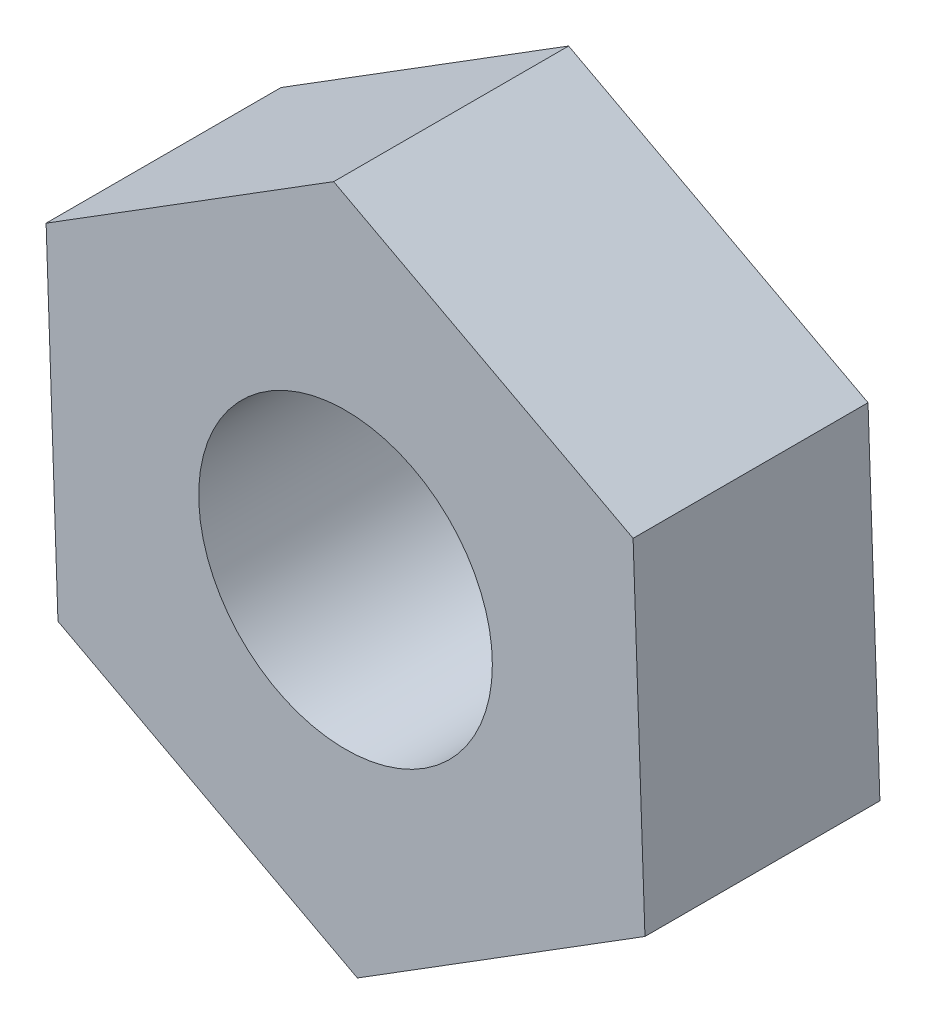
ISO-10303-21;
HEADER;
FILE_DESCRIPTION(('STEP AP214'),'2;1');
FILE_NAME('part.step','',(''),(''),'','','');
FILE_SCHEMA(('AUTOMOTIVE_DESIGN { 1 0 10303 214 1 1 1 1 }'));
ENDSEC;
DATA;
#1=APPLICATION_CONTEXT('core data for automotive mechanical design processes');
#2=APPLICATION_PROTOCOL_DEFINITION('international standard','automotive_design',2000,#1);
#3=PRODUCT_CONTEXT('',#1,'mechanical');
#4=PRODUCT('Part','Part','',(#3));
#5=PRODUCT_RELATED_PRODUCT_CATEGORY('part','',(#4));
#6=PRODUCT_DEFINITION_FORMATION('','',#4);
#7=PRODUCT_DEFINITION_CONTEXT('part definition',#1,'design');
#8=PRODUCT_DEFINITION('design','',#6,#7);
#9=PRODUCT_DEFINITION_SHAPE('','',#8);
#10=(LENGTH_UNIT() NAMED_UNIT(*) SI_UNIT(.MILLI.,.METRE.));
#11=(NAMED_UNIT(*) PLANE_ANGLE_UNIT() SI_UNIT($,.RADIAN.));
#12=(NAMED_UNIT(*) SI_UNIT($,.STERADIAN.) SOLID_ANGLE_UNIT());
#13=UNCERTAINTY_MEASURE_WITH_UNIT(LENGTH_MEASURE(1.E-05),#10,'distance_accuracy_value','');
#14=(GEOMETRIC_REPRESENTATION_CONTEXT(3) GLOBAL_UNCERTAINTY_ASSIGNED_CONTEXT((#13)) GLOBAL_UNIT_ASSIGNED_CONTEXT((#10,
#11,#12)) REPRESENTATION_CONTEXT('',''));
#15=CARTESIAN_POINT('',(0.,0.,0.));
#16=DIRECTION('',(0.,0.,1.));
#17=DIRECTION('',(1.,0.,0.));
#18=AXIS2_PLACEMENT_3D('',#15,#16,#17);
#19=CARTESIAN_POINT('',(0.,0.,1.6));
#20=DIRECTION('',(0.,0.,1.));
#21=DIRECTION('',(1.,0.,0.));
#22=AXIS2_PLACEMENT_3D('',#19,#20,#21);
#23=PLANE('',#22);
#24=DIRECTION('',(-0.034997051242381,0.999387415572329,0.));
#25=VECTOR('',#24,1.);
#26=CARTESIAN_POINT('',(2.03918594505592,-1.08399908432605,1.6));
#27=LINE('',#26,#25);
#28=CARTESIAN_POINT('',(2.03918594505592,-1.08399908432605,1.6));
#29=VERTEX_POINT('',#28);
#30=CARTESIAN_POINT('',(1.95836371723339,1.22398728929558,1.6));
#31=VERTEX_POINT('',#30);
#32=EDGE_CURVE('E133',#29,#31,#27,.T.);
#33=ORIENTED_EDGE('',*,*,#32,.T.);
#34=DIRECTION('',(-0.882993415729303,0.469385372352717,0.));
#35=VECTOR('',#34,1.);
#36=CARTESIAN_POINT('',(1.95836371723339,1.22398728929558,1.6));
#37=LINE('',#36,#35);
#38=CARTESIAN_POINT('',(-0.0808222278225275,2.30798637362164,1.6));
#39=VERTEX_POINT('',#38);
#40=EDGE_CURVE('E91',#31,#39,#37,.T.);
#41=ORIENTED_EDGE('',*,*,#40,.T.);
#42=DIRECTION('',(-0.847996364486922,-0.530002043219612,0.));
#43=VECTOR('',#42,1.);
#44=CARTESIAN_POINT('',(-0.0808222278225275,2.30798637362164,1.6));
#45=LINE('',#44,#43);
#46=CARTESIAN_POINT('',(-2.03918594505592,1.08399908432606,1.6));
#47=VERTEX_POINT('',#46);
#48=EDGE_CURVE('E104',#39,#47,#45,.T.);
#49=ORIENTED_EDGE('',*,*,#48,.T.);
#50=DIRECTION('',(0.0349970512423816,-0.999387415572329,0.));
#51=VECTOR('',#50,1.);
#52=CARTESIAN_POINT('',(-2.03918594505592,1.08399908432606,1.6));
#53=LINE('',#52,#51);
#54=CARTESIAN_POINT('',(-1.95836371723339,-1.22398728929558,1.6));
#55=VERTEX_POINT('',#54);
#56=EDGE_CURVE('E98',#47,#55,#53,.T.);
#57=ORIENTED_EDGE('',*,*,#56,.T.);
#58=DIRECTION('',(0.882993415729303,-0.469385372352716,0.));
#59=VECTOR('',#58,1.);
#60=CARTESIAN_POINT('',(-1.95836371723339,-1.22398728929558,1.6));
#61=LINE('',#60,#59);
#62=CARTESIAN_POINT('',(0.0808222278225276,-2.30798637362163,1.6));
#63=VERTEX_POINT('',#62);
#64=EDGE_CURVE('E102',#55,#63,#61,.T.);
#65=ORIENTED_EDGE('',*,*,#64,.T.);
#66=DIRECTION('',(0.847996364486922,0.530002043219612,0.));
#67=VECTOR('',#66,1.);
#68=CARTESIAN_POINT('',(0.0808222278225276,-2.30798637362163,1.6));
#69=LINE('',#68,#67);
#70=EDGE_CURVE('E54',#63,#29,#69,.T.);
#71=ORIENTED_EDGE('',*,*,#70,.T.);
#72=EDGE_LOOP('',(#33,#41,#49,#57,#65,#71));
#73=FACE_BOUND('',#72,.T.);
#74=CARTESIAN_POINT('',(0.,0.,1.6));
#75=DIRECTION('',(0.,0.,1.));
#76=DIRECTION('',(1.,0.,0.));
#77=AXIS2_PLACEMENT_3D('',#74,#75,#76);
#78=CIRCLE('',#77,1.);
#79=CARTESIAN_POINT('',(1.,0.,1.6));
#80=VERTEX_POINT('',#79);
#81=EDGE_CURVE('E126',#80,#80,#78,.T.);
#82=ORIENTED_EDGE('',*,*,#81,.F.);
#83=EDGE_LOOP('',(#82));
#84=FACE_BOUND('',#83,.T.);
#85=ADVANCED_FACE('F37',(#73,#84),#23,.T.);
#86=CARTESIAN_POINT('',(0.,0.,0.));
#87=DIRECTION('',(0.,0.,1.));
#88=DIRECTION('',(1.,0.,0.));
#89=AXIS2_PLACEMENT_3D('',#86,#87,#88);
#90=PLANE('',#89);
#91=DIRECTION('',(-0.034997051242381,0.999387415572329,0.));
#92=VECTOR('',#91,1.);
#93=CARTESIAN_POINT('',(2.03918594505592,-1.08399908432605,0.));
#94=LINE('',#93,#92);
#95=CARTESIAN_POINT('',(2.03918594505592,-1.08399908432605,0.));
#96=VERTEX_POINT('',#95);
#97=CARTESIAN_POINT('',(1.95836371723339,1.22398728929558,0.));
#98=VERTEX_POINT('',#97);
#99=EDGE_CURVE('E122',#96,#98,#94,.T.);
#100=ORIENTED_EDGE('',*,*,#99,.F.);
#101=DIRECTION('',(0.847996364486922,0.530002043219612,0.));
#102=VECTOR('',#101,1.);
#103=CARTESIAN_POINT('',(0.0808222278225276,-2.30798637362163,0.));
#104=LINE('',#103,#102);
#105=CARTESIAN_POINT('',(0.0808222278225276,-2.30798637362163,0.));
#106=VERTEX_POINT('',#105);
#107=EDGE_CURVE('E83',#106,#96,#104,.T.);
#108=ORIENTED_EDGE('',*,*,#107,.F.);
#109=DIRECTION('',(0.882993415729303,-0.469385372352716,0.));
#110=VECTOR('',#109,1.);
#111=CARTESIAN_POINT('',(-1.95836371723339,-1.22398728929558,0.));
#112=LINE('',#111,#110);
#113=CARTESIAN_POINT('',(-1.95836371723339,-1.22398728929558,0.));
#114=VERTEX_POINT('',#113);
#115=EDGE_CURVE('E77',#114,#106,#112,.T.);
#116=ORIENTED_EDGE('',*,*,#115,.F.);
#117=DIRECTION('',(0.0349970512423816,-0.999387415572329,0.));
#118=VECTOR('',#117,1.);
#119=CARTESIAN_POINT('',(-2.03918594505592,1.08399908432606,0.));
#120=LINE('',#119,#118);
#121=CARTESIAN_POINT('',(-2.03918594505592,1.08399908432606,0.));
#122=VERTEX_POINT('',#121);
#123=EDGE_CURVE('E112',#122,#114,#120,.T.);
#124=ORIENTED_EDGE('',*,*,#123,.F.);
#125=DIRECTION('',(-0.847996364486922,-0.530002043219612,0.));
#126=VECTOR('',#125,1.);
#127=CARTESIAN_POINT('',(-0.0808222278225275,2.30798637362164,0.));
#128=LINE('',#127,#126);
#129=CARTESIAN_POINT('',(-0.0808222278225275,2.30798637362164,0.));
#130=VERTEX_POINT('',#129);
#131=EDGE_CURVE('E128',#130,#122,#128,.T.);
#132=ORIENTED_EDGE('',*,*,#131,.F.);
#133=DIRECTION('',(-0.882993415729303,0.469385372352717,0.));
#134=VECTOR('',#133,1.);
#135=CARTESIAN_POINT('',(1.95836371723339,1.22398728929558,0.));
#136=LINE('',#135,#134);
#137=EDGE_CURVE('E125',#98,#130,#136,.T.);
#138=ORIENTED_EDGE('',*,*,#137,.F.);
#139=EDGE_LOOP('',(#100,#108,#116,#124,#132,#138));
#140=FACE_BOUND('',#139,.T.);
#141=CARTESIAN_POINT('',(0.,0.,0.));
#142=DIRECTION('',(0.,0.,1.));
#143=DIRECTION('',(1.,0.,0.));
#144=AXIS2_PLACEMENT_3D('',#141,#142,#143);
#145=CIRCLE('',#144,1.);
#146=CARTESIAN_POINT('',(1.,0.,0.));
#147=VERTEX_POINT('',#146);
#148=EDGE_CURVE('E228',#147,#147,#145,.T.);
#149=ORIENTED_EDGE('',*,*,#148,.T.);
#150=EDGE_LOOP('',(#149));
#151=FACE_BOUND('',#150,.T.);
#152=ADVANCED_FACE('F142',(#140,#151),#90,.F.);
#153=CARTESIAN_POINT('',(2.03918594505592,-1.08399908432605,1.6));
#154=DIRECTION('',(-0.999387415572329,-0.034997051242381,0.));
#155=DIRECTION('',(0.034997051242381,-0.999387415572329,0.));
#156=AXIS2_PLACEMENT_3D('',#153,#154,#155);
#157=PLANE('',#156);
#158=ORIENTED_EDGE('',*,*,#99,.T.);
#159=DIRECTION('',(0.,0.,-1.));
#160=VECTOR('',#159,1.);
#161=CARTESIAN_POINT('',(1.95836371723339,1.22398728929558,1.6));
#162=LINE('',#161,#160);
#163=EDGE_CURVE('E11',#31,#98,#162,.T.);
#164=ORIENTED_EDGE('',*,*,#163,.F.);
#165=ORIENTED_EDGE('',*,*,#32,.F.);
#166=DIRECTION('',(0.,0.,-1.));
#167=VECTOR('',#166,1.);
#168=CARTESIAN_POINT('',(2.03918594505592,-1.08399908432605,1.6));
#169=LINE('',#168,#167);
#170=EDGE_CURVE('E118',#29,#96,#169,.T.);
#171=ORIENTED_EDGE('',*,*,#170,.T.);
#172=EDGE_LOOP('',(#158,#164,#165,#171));
#173=FACE_BOUND('',#172,.T.);
#174=ADVANCED_FACE('F39',(#173),#157,.F.);
#175=CARTESIAN_POINT('',(1.95836371723339,1.22398728929558,1.6));
#176=DIRECTION('',(-0.469385372352717,-0.882993415729303,0.));
#177=DIRECTION('',(0.882993415729303,-0.469385372352717,0.));
#178=AXIS2_PLACEMENT_3D('',#175,#176,#177);
#179=PLANE('',#178);
#180=ORIENTED_EDGE('',*,*,#137,.T.);
#181=DIRECTION('',(0.,0.,-1.));
#182=VECTOR('',#181,1.);
#183=CARTESIAN_POINT('',(-0.0808222278225275,2.30798637362164,1.6));
#184=LINE('',#183,#182);
#185=EDGE_CURVE('E46',#39,#130,#184,.T.);
#186=ORIENTED_EDGE('',*,*,#185,.F.);
#187=ORIENTED_EDGE('',*,*,#40,.F.);
#188=ORIENTED_EDGE('',*,*,#163,.T.);
#189=EDGE_LOOP('',(#180,#186,#187,#188));
#190=FACE_BOUND('',#189,.T.);
#191=ADVANCED_FACE('F167',(#190),#179,.F.);
#192=CARTESIAN_POINT('',(-0.0808222278225275,2.30798637362164,1.6));
#193=DIRECTION('',(0.530002043219612,-0.847996364486922,0.));
#194=DIRECTION('',(0.847996364486922,0.530002043219612,0.));
#195=AXIS2_PLACEMENT_3D('',#192,#193,#194);
#196=PLANE('',#195);
#197=ORIENTED_EDGE('',*,*,#131,.T.);
#198=DIRECTION('',(0.,0.,-1.));
#199=VECTOR('',#198,1.);
#200=CARTESIAN_POINT('',(-2.03918594505592,1.08399908432606,1.6));
#201=LINE('',#200,#199);
#202=EDGE_CURVE('E113',#47,#122,#201,.T.);
#203=ORIENTED_EDGE('',*,*,#202,.F.);
#204=ORIENTED_EDGE('',*,*,#48,.F.);
#205=ORIENTED_EDGE('',*,*,#185,.T.);
#206=EDGE_LOOP('',(#197,#203,#204,#205));
#207=FACE_BOUND('',#206,.T.);
#208=ADVANCED_FACE('F139',(#207),#196,.F.);
#209=CARTESIAN_POINT('',(-2.03918594505592,1.08399908432606,1.6));
#210=DIRECTION('',(0.999387415572329,0.0349970512423816,0.));
#211=DIRECTION('',(-0.0349970512423816,0.999387415572329,0.));
#212=AXIS2_PLACEMENT_3D('',#209,#210,#211);
#213=PLANE('',#212);
#214=ORIENTED_EDGE('',*,*,#123,.T.);
#215=DIRECTION('',(0.,0.,-1.));
#216=VECTOR('',#215,1.);
#217=CARTESIAN_POINT('',(-1.95836371723339,-1.22398728929558,1.6));
#218=LINE('',#217,#216);
#219=EDGE_CURVE('E109',#55,#114,#218,.T.);
#220=ORIENTED_EDGE('',*,*,#219,.F.);
#221=ORIENTED_EDGE('',*,*,#56,.F.);
#222=ORIENTED_EDGE('',*,*,#202,.T.);
#223=EDGE_LOOP('',(#214,#220,#221,#222));
#224=FACE_BOUND('',#223,.T.);
#225=ADVANCED_FACE('F110',(#224),#213,.F.);
#226=CARTESIAN_POINT('',(-1.95836371723339,-1.22398728929558,1.6));
#227=DIRECTION('',(0.469385372352716,0.882993415729303,0.));
#228=DIRECTION('',(-0.882993415729303,0.469385372352716,0.));
#229=AXIS2_PLACEMENT_3D('',#226,#227,#228);
#230=PLANE('',#229);
#231=ORIENTED_EDGE('',*,*,#115,.T.);
#232=DIRECTION('',(0.,0.,-1.));
#233=VECTOR('',#232,1.);
#234=CARTESIAN_POINT('',(0.0808222278225276,-2.30798637362163,1.6));
#235=LINE('',#234,#233);
#236=EDGE_CURVE('E114',#63,#106,#235,.T.);
#237=ORIENTED_EDGE('',*,*,#236,.F.);
#238=ORIENTED_EDGE('',*,*,#64,.F.);
#239=ORIENTED_EDGE('',*,*,#219,.T.);
#240=EDGE_LOOP('',(#231,#237,#238,#239));
#241=FACE_BOUND('',#240,.T.);
#242=ADVANCED_FACE('F116',(#241),#230,.F.);
#243=CARTESIAN_POINT('',(0.0808222278225276,-2.30798637362163,1.6));
#244=DIRECTION('',(-0.530002043219612,0.847996364486922,0.));
#245=DIRECTION('',(-0.847996364486922,-0.530002043219612,0.));
#246=AXIS2_PLACEMENT_3D('',#243,#244,#245);
#247=PLANE('',#246);
#248=ORIENTED_EDGE('',*,*,#107,.T.);
#249=ORIENTED_EDGE('',*,*,#170,.F.);
#250=ORIENTED_EDGE('',*,*,#70,.F.);
#251=ORIENTED_EDGE('',*,*,#236,.T.);
#252=EDGE_LOOP('',(#248,#249,#250,#251));
#253=FACE_BOUND('',#252,.T.);
#254=ADVANCED_FACE('F147',(#253),#247,.F.);
#255=CARTESIAN_POINT('',(0.,0.,1.6));
#256=DIRECTION('',(0.,0.,-1.));
#257=DIRECTION('',(-1.,0.,0.));
#258=AXIS2_PLACEMENT_3D('',#255,#256,#257);
#259=CYLINDRICAL_SURFACE('',#258,1.);
#260=ORIENTED_EDGE('',*,*,#81,.T.);
#261=EDGE_LOOP('',(#260));
#262=FACE_BOUND('',#261,.T.);
#263=ORIENTED_EDGE('',*,*,#148,.F.);
#264=EDGE_LOOP('',(#263));
#265=FACE_BOUND('',#264,.T.);
#266=ADVANCED_FACE('F149',(#262,#265),#259,.F.);
#267=CLOSED_SHELL('',(#85,#152,#174,#191,#208,#225,#242,#254,#266));
#268=MANIFOLD_SOLID_BREP('B2',#267);
#269=ADVANCED_BREP_SHAPE_REPRESENTATION('',(#18,#268),#14);
#270=SHAPE_DEFINITION_REPRESENTATION(#9,#269);
ENDSEC;
END-ISO-10303-21;
